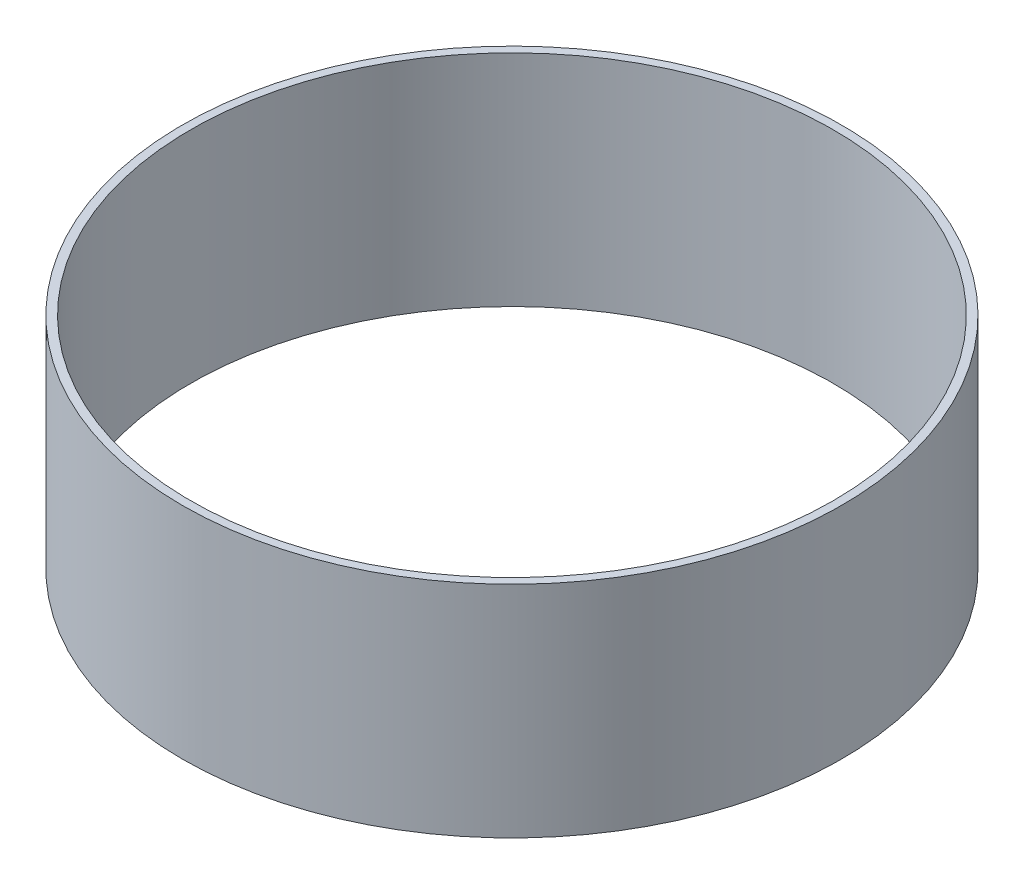
ISO-10303-21;
HEADER;
FILE_DESCRIPTION(('STEP AP214'),'2;1');
FILE_NAME('part.step','',(''),(''),'','','');
FILE_SCHEMA(('AUTOMOTIVE_DESIGN { 1 0 10303 214 1 1 1 1 }'));
ENDSEC;
DATA;
#1=APPLICATION_CONTEXT('core data for automotive mechanical design processes');
#2=APPLICATION_PROTOCOL_DEFINITION('international standard','automotive_design',2000,#1);
#3=PRODUCT_CONTEXT('',#1,'mechanical');
#4=PRODUCT('Part','Part','',(#3));
#5=PRODUCT_RELATED_PRODUCT_CATEGORY('part','',(#4));
#6=PRODUCT_DEFINITION_FORMATION('','',#4);
#7=PRODUCT_DEFINITION_CONTEXT('part definition',#1,'design');
#8=PRODUCT_DEFINITION('design','',#6,#7);
#9=PRODUCT_DEFINITION_SHAPE('','',#8);
#10=(LENGTH_UNIT() NAMED_UNIT(*) SI_UNIT(.MILLI.,.METRE.));
#11=(NAMED_UNIT(*) PLANE_ANGLE_UNIT() SI_UNIT($,.RADIAN.));
#12=(NAMED_UNIT(*) SI_UNIT($,.STERADIAN.) SOLID_ANGLE_UNIT());
#13=UNCERTAINTY_MEASURE_WITH_UNIT(LENGTH_MEASURE(1.E-05),#10,'distance_accuracy_value','');
#14=(GEOMETRIC_REPRESENTATION_CONTEXT(3) GLOBAL_UNCERTAINTY_ASSIGNED_CONTEXT((#13)) GLOBAL_UNIT_ASSIGNED_CONTEXT((#10,
#11,#12)) REPRESENTATION_CONTEXT('',''));
#15=CARTESIAN_POINT('',(0.,0.,0.));
#16=DIRECTION('',(0.,0.,1.));
#17=DIRECTION('',(1.,0.,0.));
#18=AXIS2_PLACEMENT_3D('',#15,#16,#17);
#19=CARTESIAN_POINT('',(0.,20.,0.));
#20=DIRECTION('',(0.,1.,0.));
#21=DIRECTION('',(0.,0.,1.));
#22=AXIS2_PLACEMENT_3D('',#19,#20,#21);
#23=PLANE('',#22);
#24=CARTESIAN_POINT('',(0.,20.,0.));
#25=DIRECTION('',(0.,1.,0.));
#26=DIRECTION('',(0.,0.,1.));
#27=AXIS2_PLACEMENT_3D('',#24,#25,#26);
#28=CIRCLE('',#27,60.);
#29=CARTESIAN_POINT('',(0.,20.,60.));
#30=VERTEX_POINT('',#29);
#31=EDGE_CURVE('E11',#30,#30,#28,.T.);
#32=ORIENTED_EDGE('',*,*,#31,.T.);
#33=EDGE_LOOP('',(#32));
#34=FACE_BOUND('',#33,.T.);
#35=CARTESIAN_POINT('',(0.,20.,0.));
#36=DIRECTION('',(0.,1.,0.));
#37=DIRECTION('',(1.,0.,0.));
#38=AXIS2_PLACEMENT_3D('',#35,#36,#37);
#39=CIRCLE('',#38,58.5);
#40=CARTESIAN_POINT('',(58.5,20.,0.));
#41=VERTEX_POINT('',#40);
#42=EDGE_CURVE('E48',#41,#41,#39,.T.);
#43=ORIENTED_EDGE('',*,*,#42,.F.);
#44=EDGE_LOOP('',(#43));
#45=FACE_BOUND('',#44,.T.);
#46=ADVANCED_FACE('F37',(#34,#45),#23,.T.);
#47=CARTESIAN_POINT('',(0.,-20.,0.));
#48=DIRECTION('',(0.,1.,0.));
#49=DIRECTION('',(0.,0.,1.));
#50=AXIS2_PLACEMENT_3D('',#47,#48,#49);
#51=PLANE('',#50);
#52=CARTESIAN_POINT('',(0.,-20.,0.));
#53=DIRECTION('',(0.,1.,0.));
#54=DIRECTION('',(0.,0.,1.));
#55=AXIS2_PLACEMENT_3D('',#52,#53,#54);
#56=CIRCLE('',#55,60.);
#57=CARTESIAN_POINT('',(0.,-20.,60.));
#58=VERTEX_POINT('',#57);
#59=EDGE_CURVE('E41',#58,#58,#56,.T.);
#60=ORIENTED_EDGE('',*,*,#59,.F.);
#61=EDGE_LOOP('',(#60));
#62=FACE_BOUND('',#61,.T.);
#63=CARTESIAN_POINT('',(0.,-20.,0.));
#64=DIRECTION('',(0.,1.,0.));
#65=DIRECTION('',(1.,0.,0.));
#66=AXIS2_PLACEMENT_3D('',#63,#64,#65);
#67=CIRCLE('',#66,58.5);
#68=CARTESIAN_POINT('',(58.5,-20.,0.));
#69=VERTEX_POINT('',#68);
#70=EDGE_CURVE('E50',#69,#69,#67,.T.);
#71=ORIENTED_EDGE('',*,*,#70,.T.);
#72=EDGE_LOOP('',(#71));
#73=FACE_BOUND('',#72,.T.);
#74=ADVANCED_FACE('F60',(#62,#73),#51,.F.);
#75=CARTESIAN_POINT('',(0.,20.,0.));
#76=DIRECTION('',(0.,-1.,0.));
#77=DIRECTION('',(0.,0.,-1.));
#78=AXIS2_PLACEMENT_3D('',#75,#76,#77);
#79=CYLINDRICAL_SURFACE('',#78,60.);
#80=ORIENTED_EDGE('',*,*,#31,.F.);
#81=EDGE_LOOP('',(#80));
#82=FACE_BOUND('',#81,.T.);
#83=ORIENTED_EDGE('',*,*,#59,.T.);
#84=EDGE_LOOP('',(#83));
#85=FACE_BOUND('',#84,.T.);
#86=ADVANCED_FACE('F39',(#82,#85),#79,.T.);
#87=CARTESIAN_POINT('',(0.,20.,0.));
#88=DIRECTION('',(0.,-1.,0.));
#89=DIRECTION('',(0.,0.,-1.));
#90=AXIS2_PLACEMENT_3D('',#87,#88,#89);
#91=CYLINDRICAL_SURFACE('',#90,58.5);
#92=ORIENTED_EDGE('',*,*,#42,.T.);
#93=EDGE_LOOP('',(#92));
#94=FACE_BOUND('',#93,.T.);
#95=ORIENTED_EDGE('',*,*,#70,.F.);
#96=EDGE_LOOP('',(#95));
#97=FACE_BOUND('',#96,.T.);
#98=ADVANCED_FACE('F56',(#94,#97),#91,.F.);
#99=CLOSED_SHELL('',(#46,#74,#86,#98));
#100=MANIFOLD_SOLID_BREP('B2',#99);
#101=ADVANCED_BREP_SHAPE_REPRESENTATION('',(#18,#100),#14);
#102=SHAPE_DEFINITION_REPRESENTATION(#9,#101);
ENDSEC;
END-ISO-10303-21;
